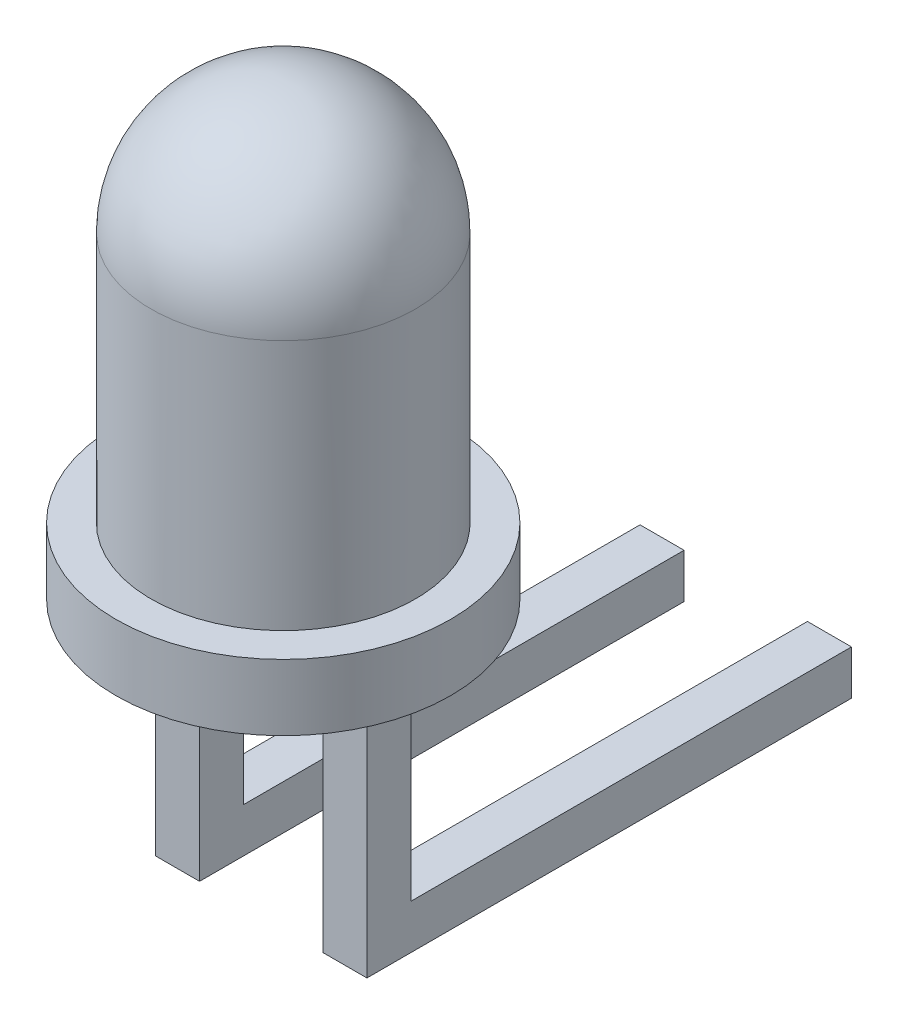
ISO-10303-21;
HEADER;
FILE_DESCRIPTION(('STEP AP214'),'2;1');
FILE_NAME('part.step','',(''),(''),'','','');
FILE_SCHEMA(('AUTOMOTIVE_DESIGN { 1 0 10303 214 1 1 1 1 }'));
ENDSEC;
DATA;
#1=APPLICATION_CONTEXT('core data for automotive mechanical design processes');
#2=APPLICATION_PROTOCOL_DEFINITION('international standard','automotive_design',2000,#1);
#3=PRODUCT_CONTEXT('',#1,'mechanical');
#4=PRODUCT('Part','Part','',(#3));
#5=PRODUCT_RELATED_PRODUCT_CATEGORY('part','',(#4));
#6=PRODUCT_DEFINITION_FORMATION('','',#4);
#7=PRODUCT_DEFINITION_CONTEXT('part definition',#1,'design');
#8=PRODUCT_DEFINITION('design','',#6,#7);
#9=PRODUCT_DEFINITION_SHAPE('','',#8);
#10=(LENGTH_UNIT() NAMED_UNIT(*) SI_UNIT(.MILLI.,.METRE.));
#11=(NAMED_UNIT(*) PLANE_ANGLE_UNIT() SI_UNIT($,.RADIAN.));
#12=(NAMED_UNIT(*) SI_UNIT($,.STERADIAN.) SOLID_ANGLE_UNIT());
#13=UNCERTAINTY_MEASURE_WITH_UNIT(LENGTH_MEASURE(1.E-05),#10,'distance_accuracy_value','');
#14=(GEOMETRIC_REPRESENTATION_CONTEXT(3) GLOBAL_UNCERTAINTY_ASSIGNED_CONTEXT((#13)) GLOBAL_UNIT_ASSIGNED_CONTEXT((#10,
#11,#12)) REPRESENTATION_CONTEXT('',''));
#15=CARTESIAN_POINT('',(0.,0.,0.));
#16=DIRECTION('',(0.,0.,1.));
#17=DIRECTION('',(1.,0.,0.));
#18=AXIS2_PLACEMENT_3D('',#15,#16,#17);
#19=CARTESIAN_POINT('',(0.,0.,-0.25));
#20=DIRECTION('',(0.,0.,-1.));
#21=DIRECTION('',(-1.,0.,0.));
#22=AXIS2_PLACEMENT_3D('',#19,#20,#21);
#23=PLANE('',#22);
#24=DIRECTION('',(0.,1.,0.));
#25=VECTOR('',#24,1.);
#26=CARTESIAN_POINT('',(1.2,2.46652278103782,-0.25));
#27=LINE('',#26,#25);
#28=CARTESIAN_POINT('',(1.2,-0.0286794382905547,-0.25));
#29=VERTEX_POINT('',#28);
#30=CARTESIAN_POINT('',(1.2,2.46652278103782,-0.25));
#31=VERTEX_POINT('',#30);
#32=EDGE_CURVE('E168',#29,#31,#27,.T.);
#33=ORIENTED_EDGE('',*,*,#32,.F.);
#34=DIRECTION('',(1.,0.,0.));
#35=VECTOR('',#34,1.);
#36=CARTESIAN_POINT('',(0.700000000000001,-0.0286794382905547,-0.25));
#37=LINE('',#36,#35);
#38=CARTESIAN_POINT('',(0.700000000000001,-0.0286794382905547,-0.25));
#39=VERTEX_POINT('',#38);
#40=EDGE_CURVE('E140',#39,#29,#37,.T.);
#41=ORIENTED_EDGE('',*,*,#40,.F.);
#42=DIRECTION('',(0.,-1.,0.));
#43=VECTOR('',#42,1.);
#44=CARTESIAN_POINT('',(0.700000000000001,-0.533477218962179,-0.25));
#45=LINE('',#44,#43);
#46=CARTESIAN_POINT('',(0.700000000000001,2.46652278103782,-0.25));
#47=VERTEX_POINT('',#46);
#48=EDGE_CURVE('E145',#47,#39,#45,.T.);
#49=ORIENTED_EDGE('',*,*,#48,.F.);
#50=DIRECTION('',(-1.,0.,0.));
#51=VECTOR('',#50,1.);
#52=CARTESIAN_POINT('',(0.700000000000001,2.46652278103782,-0.25));
#53=LINE('',#52,#51);
#54=EDGE_CURVE('E178',#31,#47,#53,.T.);
#55=ORIENTED_EDGE('',*,*,#54,.F.);
#56=EDGE_LOOP('',(#33,#41,#49,#55));
#57=FACE_BOUND('',#56,.T.);
#58=ADVANCED_FACE('F32',(#57),#23,.T.);
#59=CARTESIAN_POINT('',(0.,0.,-0.25));
#60=DIRECTION('',(0.,0.,-1.));
#61=DIRECTION('',(-1.,0.,0.));
#62=AXIS2_PLACEMENT_3D('',#59,#60,#61);
#63=PLANE('',#62);
#64=DIRECTION('',(0.,1.,0.));
#65=VECTOR('',#64,1.);
#66=CARTESIAN_POINT('',(-0.699999999999999,2.46652278103782,-0.25));
#67=LINE('',#66,#65);
#68=CARTESIAN_POINT('',(-0.699999999999999,-0.0286794382905551,-0.25));
#69=VERTEX_POINT('',#68);
#70=CARTESIAN_POINT('',(-0.699999999999999,2.46652278103782,-0.25));
#71=VERTEX_POINT('',#70);
#72=EDGE_CURVE('E192',#69,#71,#67,.T.);
#73=ORIENTED_EDGE('',*,*,#72,.F.);
#74=DIRECTION('',(1.,0.,0.));
#75=VECTOR('',#74,1.);
#76=CARTESIAN_POINT('',(-1.2,-0.0286794382905551,-0.25));
#77=LINE('',#76,#75);
#78=CARTESIAN_POINT('',(-1.2,-0.0286794382905551,-0.25));
#79=VERTEX_POINT('',#78);
#80=EDGE_CURVE('E146',#79,#69,#77,.T.);
#81=ORIENTED_EDGE('',*,*,#80,.F.);
#82=DIRECTION('',(0.,-1.,0.));
#83=VECTOR('',#82,1.);
#84=CARTESIAN_POINT('',(-1.2,-0.533477218962179,-0.25));
#85=LINE('',#84,#83);
#86=CARTESIAN_POINT('',(-1.2,2.46652278103782,-0.25));
#87=VERTEX_POINT('',#86);
#88=EDGE_CURVE('E201',#87,#79,#85,.T.);
#89=ORIENTED_EDGE('',*,*,#88,.F.);
#90=DIRECTION('',(-1.,0.,0.));
#91=VECTOR('',#90,1.);
#92=CARTESIAN_POINT('',(-0.699999999999999,2.46652278103782,-0.25));
#93=LINE('',#92,#91);
#94=EDGE_CURVE('E187',#71,#87,#93,.T.);
#95=ORIENTED_EDGE('',*,*,#94,.F.);
#96=EDGE_LOOP('',(#73,#81,#89,#95));
#97=FACE_BOUND('',#96,.T.);
#98=ADVANCED_FACE('F228',(#97),#63,.T.);
#99=CARTESIAN_POINT('',(-1.9,2.46652278103782,0.));
#100=DIRECTION('',(0.,-1.,0.));
#101=DIRECTION('',(1.,0.,0.));
#102=AXIS2_PLACEMENT_3D('',#99,#100,#101);
#103=PLANE('',#102);
#104=CARTESIAN_POINT('',(0.,2.46652278103782,0.));
#105=DIRECTION('',(0.,1.,0.));
#106=DIRECTION('',(-1.,0.,0.));
#107=AXIS2_PLACEMENT_3D('',#104,#105,#106);
#108=CIRCLE('',#107,1.9);
#109=CARTESIAN_POINT('',(-1.9,2.46652278103782,0.));
#110=VERTEX_POINT('',#109);
#111=EDGE_CURVE('E40',#110,#110,#108,.T.);
#112=ORIENTED_EDGE('',*,*,#111,.F.);
#113=EDGE_LOOP('',(#112));
#114=FACE_BOUND('',#113,.T.);
#115=DIRECTION('',(0.,0.,-1.));
#116=VECTOR('',#115,1.);
#117=CARTESIAN_POINT('',(-1.2,2.46652278103782,0.25));
#118=LINE('',#117,#116);
#119=CARTESIAN_POINT('',(-1.2,2.46652278103782,0.25));
#120=VERTEX_POINT('',#119);
#121=EDGE_CURVE('E211',#120,#87,#118,.T.);
#122=ORIENTED_EDGE('',*,*,#121,.F.);
#123=DIRECTION('',(-1.,0.,0.));
#124=VECTOR('',#123,1.);
#125=CARTESIAN_POINT('',(-0.699999999999999,2.46652278103782,0.25));
#126=LINE('',#125,#124);
#127=CARTESIAN_POINT('',(-0.699999999999999,2.46652278103782,0.25));
#128=VERTEX_POINT('',#127);
#129=EDGE_CURVE('E188',#128,#120,#126,.T.);
#130=ORIENTED_EDGE('',*,*,#129,.F.);
#131=DIRECTION('',(0.,0.,-1.));
#132=VECTOR('',#131,1.);
#133=CARTESIAN_POINT('',(-0.699999999999999,2.46652278103782,0.25));
#134=LINE('',#133,#132);
#135=EDGE_CURVE('E199',#128,#71,#134,.T.);
#136=ORIENTED_EDGE('',*,*,#135,.T.);
#137=ORIENTED_EDGE('',*,*,#94,.T.);
#138=EDGE_LOOP('',(#122,#130,#136,#137));
#139=FACE_BOUND('',#138,.T.);
#140=DIRECTION('',(0.,0.,-1.));
#141=VECTOR('',#140,1.);
#142=CARTESIAN_POINT('',(0.700000000000001,2.46652278103782,0.25));
#143=LINE('',#142,#141);
#144=CARTESIAN_POINT('',(0.700000000000001,2.46652278103782,0.25));
#145=VERTEX_POINT('',#144);
#146=EDGE_CURVE('E52',#145,#47,#143,.T.);
#147=ORIENTED_EDGE('',*,*,#146,.F.);
#148=DIRECTION('',(-1.,0.,0.));
#149=VECTOR('',#148,1.);
#150=CARTESIAN_POINT('',(0.700000000000001,2.46652278103782,0.25));
#151=LINE('',#150,#149);
#152=CARTESIAN_POINT('',(1.2,2.46652278103782,0.25));
#153=VERTEX_POINT('',#152);
#154=EDGE_CURVE('E47',#153,#145,#151,.T.);
#155=ORIENTED_EDGE('',*,*,#154,.F.);
#156=DIRECTION('',(0.,0.,-1.));
#157=VECTOR('',#156,1.);
#158=CARTESIAN_POINT('',(1.2,2.46652278103782,0.25));
#159=LINE('',#158,#157);
#160=EDGE_CURVE('E185',#153,#31,#159,.T.);
#161=ORIENTED_EDGE('',*,*,#160,.T.);
#162=ORIENTED_EDGE('',*,*,#54,.T.);
#163=EDGE_LOOP('',(#147,#155,#161,#162));
#164=FACE_BOUND('',#163,.T.);
#165=ADVANCED_FACE('F225',(#114,#139,#164),#103,.T.);
#166=CARTESIAN_POINT('',(-1.5,3.21652278103782,0.));
#167=DIRECTION('',(0.,1.,0.));
#168=DIRECTION('',(-1.,0.,0.));
#169=AXIS2_PLACEMENT_3D('',#166,#167,#168);
#170=PLANE('',#169);
#171=CARTESIAN_POINT('',(0.,3.21652278103782,0.));
#172=DIRECTION('',(0.,1.,0.));
#173=DIRECTION('',(-1.,0.,0.));
#174=AXIS2_PLACEMENT_3D('',#171,#172,#173);
#175=CIRCLE('',#174,1.9);
#176=CARTESIAN_POINT('',(-1.9,3.21652278103782,0.));
#177=VERTEX_POINT('',#176);
#178=EDGE_CURVE('E11',#177,#177,#175,.T.);
#179=ORIENTED_EDGE('',*,*,#178,.T.);
#180=EDGE_LOOP('',(#179));
#181=FACE_BOUND('',#180,.T.);
#182=CARTESIAN_POINT('',(0.,3.21652278103782,0.));
#183=DIRECTION('',(0.,1.,0.));
#184=DIRECTION('',(-1.,0.,0.));
#185=AXIS2_PLACEMENT_3D('',#182,#183,#184);
#186=CIRCLE('',#185,1.5);
#187=CARTESIAN_POINT('',(-1.5,3.21652278103782,0.));
#188=VERTEX_POINT('',#187);
#189=EDGE_CURVE('E214',#188,#188,#186,.T.);
#190=ORIENTED_EDGE('',*,*,#189,.F.);
#191=EDGE_LOOP('',(#190));
#192=FACE_BOUND('',#191,.T.);
#193=ADVANCED_FACE('F34',(#181,#192),#170,.T.);
#194=CARTESIAN_POINT('',(0.,7.56652278103782,0.));
#195=DIRECTION('',(0.,1.,0.));
#196=DIRECTION('',(-1.,0.,0.));
#197=AXIS2_PLACEMENT_3D('',#194,#195,#196);
#198=CYLINDRICAL_SURFACE('',#197,1.9);
#199=ORIENTED_EDGE('',*,*,#111,.T.);
#200=EDGE_LOOP('',(#199));
#201=FACE_BOUND('',#200,.T.);
#202=ORIENTED_EDGE('',*,*,#178,.F.);
#203=EDGE_LOOP('',(#202));
#204=FACE_BOUND('',#203,.T.);
#205=ADVANCED_FACE('F222',(#201,#204),#198,.T.);
#206=CARTESIAN_POINT('',(0.,6.06652278103782,0.));
#207=DIRECTION('',(0.,1.,0.));
#208=DIRECTION('',(1.,0.,0.));
#209=AXIS2_PLACEMENT_3D('',#206,#207,#208);
#210=SPHERICAL_SURFACE('',#209,1.5);
#211=CARTESIAN_POINT('',(0.,6.06652278103782,0.));
#212=DIRECTION('',(0.,1.,0.));
#213=DIRECTION('',(-1.,0.,0.));
#214=AXIS2_PLACEMENT_3D('',#211,#212,#213);
#215=CIRCLE('',#214,1.5);
#216=CARTESIAN_POINT('',(-1.5,6.06652278103782,0.));
#217=VERTEX_POINT('',#216);
#218=EDGE_CURVE('E217',#217,#217,#215,.T.);
#219=ORIENTED_EDGE('',*,*,#218,.T.);
#220=EDGE_LOOP('',(#219));
#221=FACE_BOUND('',#220,.T.);
#222=ADVANCED_FACE('F409',(#221),#210,.T.);
#223=CARTESIAN_POINT('',(0.,7.56652278103782,0.));
#224=DIRECTION('',(0.,1.,0.));
#225=DIRECTION('',(-1.,0.,0.));
#226=AXIS2_PLACEMENT_3D('',#223,#224,#225);
#227=CYLINDRICAL_SURFACE('',#226,1.5);
#228=ORIENTED_EDGE('',*,*,#189,.T.);
#229=EDGE_LOOP('',(#228));
#230=FACE_BOUND('',#229,.T.);
#231=ORIENTED_EDGE('',*,*,#218,.F.);
#232=EDGE_LOOP('',(#231));
#233=FACE_BOUND('',#232,.T.);
#234=ADVANCED_FACE('F265',(#230,#233),#227,.T.);
#235=CARTESIAN_POINT('',(-1.2,-0.533477218962179,0.25));
#236=DIRECTION('',(1.,0.,0.));
#237=DIRECTION('',(0.,0.,-1.));
#238=AXIS2_PLACEMENT_3D('',#235,#236,#237);
#239=PLANE('',#238);
#240=ORIENTED_EDGE('',*,*,#88,.T.);
#241=DIRECTION('',(0.,0.,1.));
#242=VECTOR('',#241,1.);
#243=CARTESIAN_POINT('',(-1.2,-0.0286794382905551,-5.25));
#244=LINE('',#243,#242);
#245=CARTESIAN_POINT('',(-1.2,-0.0286794382905551,-5.25));
#246=VERTEX_POINT('',#245);
#247=EDGE_CURVE('E166',#246,#79,#244,.T.);
#248=ORIENTED_EDGE('',*,*,#247,.F.);
#249=DIRECTION('',(0.,1.,0.));
#250=VECTOR('',#249,1.);
#251=CARTESIAN_POINT('',(-1.2,-0.533477218962179,-5.25));
#252=LINE('',#251,#250);
#253=CARTESIAN_POINT('',(-1.2,-0.533477218962179,-5.25));
#254=VERTEX_POINT('',#253);
#255=EDGE_CURVE('E148',#254,#246,#252,.T.);
#256=ORIENTED_EDGE('',*,*,#255,.F.);
#257=DIRECTION('',(0.,0.,-1.));
#258=VECTOR('',#257,1.);
#259=CARTESIAN_POINT('',(-1.2,-0.533477218962179,0.25));
#260=LINE('',#259,#258);
#261=CARTESIAN_POINT('',(-1.2,-0.533477218962179,0.25));
#262=VERTEX_POINT('',#261);
#263=EDGE_CURVE('E209',#262,#254,#260,.T.);
#264=ORIENTED_EDGE('',*,*,#263,.F.);
#265=DIRECTION('',(0.,-1.,0.));
#266=VECTOR('',#265,1.);
#267=CARTESIAN_POINT('',(-1.2,-0.533477218962179,0.25));
#268=LINE('',#267,#266);
#269=EDGE_CURVE('E191',#120,#262,#268,.T.);
#270=ORIENTED_EDGE('',*,*,#269,.F.);
#271=ORIENTED_EDGE('',*,*,#121,.T.);
#272=EDGE_LOOP('',(#240,#248,#256,#264,#270,#271));
#273=FACE_BOUND('',#272,.T.);
#274=ADVANCED_FACE('F235',(#273),#239,.F.);
#275=CARTESIAN_POINT('',(-0.699999999999999,-0.533477218962179,0.25));
#276=DIRECTION('',(0.,1.,0.));
#277=DIRECTION('',(-1.,0.,0.));
#278=AXIS2_PLACEMENT_3D('',#275,#276,#277);
#279=PLANE('',#278);
#280=ORIENTED_EDGE('',*,*,#263,.T.);
#281=DIRECTION('',(-1.,0.,0.));
#282=VECTOR('',#281,1.);
#283=CARTESIAN_POINT('',(-1.2,-0.533477218962179,-5.25));
#284=LINE('',#283,#282);
#285=CARTESIAN_POINT('',(-0.699999999999999,-0.533477218962179,-5.25));
#286=VERTEX_POINT('',#285);
#287=EDGE_CURVE('E160',#286,#254,#284,.T.);
#288=ORIENTED_EDGE('',*,*,#287,.F.);
#289=DIRECTION('',(0.,0.,-1.));
#290=VECTOR('',#289,1.);
#291=CARTESIAN_POINT('',(-0.699999999999999,-0.533477218962179,0.25));
#292=LINE('',#291,#290);
#293=CARTESIAN_POINT('',(-0.699999999999999,-0.533477218962179,0.25));
#294=VERTEX_POINT('',#293);
#295=EDGE_CURVE('E207',#294,#286,#292,.T.);
#296=ORIENTED_EDGE('',*,*,#295,.F.);
#297=DIRECTION('',(1.,0.,0.));
#298=VECTOR('',#297,1.);
#299=CARTESIAN_POINT('',(-0.699999999999999,-0.533477218962179,0.25));
#300=LINE('',#299,#298);
#301=EDGE_CURVE('E194',#262,#294,#300,.T.);
#302=ORIENTED_EDGE('',*,*,#301,.F.);
#303=EDGE_LOOP('',(#280,#288,#296,#302));
#304=FACE_BOUND('',#303,.T.);
#305=ADVANCED_FACE('F257',(#304),#279,.F.);
#306=CARTESIAN_POINT('',(-0.699999999999999,2.46652278103782,0.25));
#307=DIRECTION('',(-1.,0.,0.));
#308=DIRECTION('',(0.,-1.,0.));
#309=AXIS2_PLACEMENT_3D('',#306,#307,#308);
#310=PLANE('',#309);
#311=ORIENTED_EDGE('',*,*,#295,.T.);
#312=DIRECTION('',(0.,-1.,0.));
#313=VECTOR('',#312,1.);
#314=CARTESIAN_POINT('',(-0.699999999999999,-0.533477218962179,-5.25));
#315=LINE('',#314,#313);
#316=CARTESIAN_POINT('',(-0.699999999999999,-0.0286794382905551,-5.25));
#317=VERTEX_POINT('',#316);
#318=EDGE_CURVE('E157',#317,#286,#315,.T.);
#319=ORIENTED_EDGE('',*,*,#318,.F.);
#320=DIRECTION('',(0.,0.,1.));
#321=VECTOR('',#320,1.);
#322=CARTESIAN_POINT('',(-0.699999999999999,-0.0286794382905551,-5.25));
#323=LINE('',#322,#321);
#324=EDGE_CURVE('E162',#317,#69,#323,.T.);
#325=ORIENTED_EDGE('',*,*,#324,.T.);
#326=ORIENTED_EDGE('',*,*,#72,.T.);
#327=ORIENTED_EDGE('',*,*,#135,.F.);
#328=DIRECTION('',(0.,1.,0.));
#329=VECTOR('',#328,1.);
#330=CARTESIAN_POINT('',(-0.699999999999999,2.46652278103782,0.25));
#331=LINE('',#330,#329);
#332=EDGE_CURVE('E196',#294,#128,#331,.T.);
#333=ORIENTED_EDGE('',*,*,#332,.F.);
#334=EDGE_LOOP('',(#311,#319,#325,#326,#327,#333));
#335=FACE_BOUND('',#334,.T.);
#336=ADVANCED_FACE('F244',(#335),#310,.F.);
#337=CARTESIAN_POINT('',(0.,0.,0.25));
#338=DIRECTION('',(0.,0.,-1.));
#339=DIRECTION('',(-1.,0.,0.));
#340=AXIS2_PLACEMENT_3D('',#337,#338,#339);
#341=PLANE('',#340);
#342=ORIENTED_EDGE('',*,*,#129,.T.);
#343=ORIENTED_EDGE('',*,*,#269,.T.);
#344=ORIENTED_EDGE('',*,*,#301,.T.);
#345=ORIENTED_EDGE('',*,*,#332,.T.);
#346=EDGE_LOOP('',(#342,#343,#344,#345));
#347=FACE_BOUND('',#346,.T.);
#348=ADVANCED_FACE('F239',(#347),#341,.F.);
#349=CARTESIAN_POINT('',(1.2,2.46652278103782,0.25));
#350=DIRECTION('',(-1.,0.,0.));
#351=DIRECTION('',(0.,-1.,0.));
#352=AXIS2_PLACEMENT_3D('',#349,#350,#351);
#353=PLANE('',#352);
#354=DIRECTION('',(0.,0.,-1.));
#355=VECTOR('',#354,1.);
#356=CARTESIAN_POINT('',(1.2,-0.533477218962179,0.25));
#357=LINE('',#356,#355);
#358=CARTESIAN_POINT('',(1.2,-0.533477218962179,0.25));
#359=VERTEX_POINT('',#358);
#360=CARTESIAN_POINT('',(1.2,-0.533477218962179,-5.25));
#361=VERTEX_POINT('',#360);
#362=EDGE_CURVE('E176',#359,#361,#357,.T.);
#363=ORIENTED_EDGE('',*,*,#362,.T.);
#364=DIRECTION('',(0.,-1.,0.));
#365=VECTOR('',#364,1.);
#366=CARTESIAN_POINT('',(1.2,-0.533477218962179,-5.25));
#367=LINE('',#366,#365);
#368=CARTESIAN_POINT('',(1.2,-0.0286794382905547,-5.25));
#369=VERTEX_POINT('',#368);
#370=EDGE_CURVE('E130',#369,#361,#367,.T.);
#371=ORIENTED_EDGE('',*,*,#370,.F.);
#372=DIRECTION('',(0.,0.,1.));
#373=VECTOR('',#372,1.);
#374=CARTESIAN_POINT('',(1.2,-0.0286794382905547,-5.25));
#375=LINE('',#374,#373);
#376=EDGE_CURVE('E126',#369,#29,#375,.T.);
#377=ORIENTED_EDGE('',*,*,#376,.T.);
#378=ORIENTED_EDGE('',*,*,#32,.T.);
#379=ORIENTED_EDGE('',*,*,#160,.F.);
#380=DIRECTION('',(0.,1.,0.));
#381=VECTOR('',#380,1.);
#382=CARTESIAN_POINT('',(1.2,2.46652278103782,0.25));
#383=LINE('',#382,#381);
#384=EDGE_CURVE('E169',#359,#153,#383,.T.);
#385=ORIENTED_EDGE('',*,*,#384,.F.);
#386=EDGE_LOOP('',(#363,#371,#377,#378,#379,#385));
#387=FACE_BOUND('',#386,.T.);
#388=ADVANCED_FACE('F285',(#387),#353,.F.);
#389=CARTESIAN_POINT('',(0.700000000000001,-0.533477218962179,0.25));
#390=DIRECTION('',(1.,0.,0.));
#391=DIRECTION('',(0.,1.,0.));
#392=AXIS2_PLACEMENT_3D('',#389,#390,#391);
#393=PLANE('',#392);
#394=ORIENTED_EDGE('',*,*,#48,.T.);
#395=DIRECTION('',(0.,0.,1.));
#396=VECTOR('',#395,1.);
#397=CARTESIAN_POINT('',(0.700000000000001,-0.0286794382905547,-5.25));
#398=LINE('',#397,#396);
#399=CARTESIAN_POINT('',(0.700000000000001,-0.0286794382905547,-5.25));
#400=VERTEX_POINT('',#399);
#401=EDGE_CURVE('E123',#400,#39,#398,.T.);
#402=ORIENTED_EDGE('',*,*,#401,.F.);
#403=DIRECTION('',(0.,1.,0.));
#404=VECTOR('',#403,1.);
#405=CARTESIAN_POINT('',(0.700000000000001,-0.533477218962179,-5.25));
#406=LINE('',#405,#404);
#407=CARTESIAN_POINT('',(0.700000000000001,-0.533477218962179,-5.25));
#408=VERTEX_POINT('',#407);
#409=EDGE_CURVE('E131',#408,#400,#406,.T.);
#410=ORIENTED_EDGE('',*,*,#409,.F.);
#411=DIRECTION('',(0.,0.,-1.));
#412=VECTOR('',#411,1.);
#413=CARTESIAN_POINT('',(0.700000000000001,-0.533477218962179,0.25));
#414=LINE('',#413,#412);
#415=CARTESIAN_POINT('',(0.700000000000001,-0.533477218962179,0.25));
#416=VERTEX_POINT('',#415);
#417=EDGE_CURVE('E182',#416,#408,#414,.T.);
#418=ORIENTED_EDGE('',*,*,#417,.F.);
#419=DIRECTION('',(0.,-1.,0.));
#420=VECTOR('',#419,1.);
#421=CARTESIAN_POINT('',(0.700000000000001,-0.533477218962179,0.25));
#422=LINE('',#421,#420);
#423=EDGE_CURVE('E172',#145,#416,#422,.T.);
#424=ORIENTED_EDGE('',*,*,#423,.F.);
#425=ORIENTED_EDGE('',*,*,#146,.T.);
#426=EDGE_LOOP('',(#394,#402,#410,#418,#424,#425));
#427=FACE_BOUND('',#426,.T.);
#428=ADVANCED_FACE('F143',(#427),#393,.F.);
#429=CARTESIAN_POINT('',(1.2,-0.533477218962179,0.25));
#430=DIRECTION('',(0.,1.,0.));
#431=DIRECTION('',(0.,0.,1.));
#432=AXIS2_PLACEMENT_3D('',#429,#430,#431);
#433=PLANE('',#432);
#434=ORIENTED_EDGE('',*,*,#417,.T.);
#435=DIRECTION('',(-1.,0.,0.));
#436=VECTOR('',#435,1.);
#437=CARTESIAN_POINT('',(0.700000000000001,-0.533477218962179,-5.25));
#438=LINE('',#437,#436);
#439=EDGE_CURVE('E137',#361,#408,#438,.T.);
#440=ORIENTED_EDGE('',*,*,#439,.F.);
#441=ORIENTED_EDGE('',*,*,#362,.F.);
#442=DIRECTION('',(1.,0.,0.));
#443=VECTOR('',#442,1.);
#444=CARTESIAN_POINT('',(1.2,-0.533477218962179,0.25));
#445=LINE('',#444,#443);
#446=EDGE_CURVE('E174',#416,#359,#445,.T.);
#447=ORIENTED_EDGE('',*,*,#446,.F.);
#448=EDGE_LOOP('',(#434,#440,#441,#447));
#449=FACE_BOUND('',#448,.T.);
#450=ADVANCED_FACE('F279',(#449),#433,.F.);
#451=CARTESIAN_POINT('',(0.,0.,0.25));
#452=DIRECTION('',(0.,0.,-1.));
#453=DIRECTION('',(-1.,0.,0.));
#454=AXIS2_PLACEMENT_3D('',#451,#452,#453);
#455=PLANE('',#454);
#456=ORIENTED_EDGE('',*,*,#384,.T.);
#457=ORIENTED_EDGE('',*,*,#154,.T.);
#458=ORIENTED_EDGE('',*,*,#423,.T.);
#459=ORIENTED_EDGE('',*,*,#446,.T.);
#460=EDGE_LOOP('',(#456,#457,#458,#459));
#461=FACE_BOUND('',#460,.T.);
#462=ADVANCED_FACE('F277',(#461),#455,.F.);
#463=CARTESIAN_POINT('',(-1.2,-0.0286794382905551,-5.25));
#464=DIRECTION('',(0.,-1.,0.));
#465=DIRECTION('',(0.,0.,-1.));
#466=AXIS2_PLACEMENT_3D('',#463,#464,#465);
#467=PLANE('',#466);
#468=ORIENTED_EDGE('',*,*,#80,.T.);
#469=ORIENTED_EDGE('',*,*,#324,.F.);
#470=DIRECTION('',(1.,0.,0.));
#471=VECTOR('',#470,1.);
#472=CARTESIAN_POINT('',(-1.2,-0.0286794382905551,-5.25));
#473=LINE('',#472,#471);
#474=EDGE_CURVE('E155',#246,#317,#473,.T.);
#475=ORIENTED_EDGE('',*,*,#474,.F.);
#476=ORIENTED_EDGE('',*,*,#247,.T.);
#477=EDGE_LOOP('',(#468,#469,#475,#476));
#478=FACE_BOUND('',#477,.T.);
#479=ADVANCED_FACE('F250',(#478),#467,.F.);
#480=CARTESIAN_POINT('',(0.,0.,-5.25));
#481=DIRECTION('',(0.,0.,-1.));
#482=DIRECTION('',(-1.,0.,0.));
#483=AXIS2_PLACEMENT_3D('',#480,#481,#482);
#484=PLANE('',#483);
#485=ORIENTED_EDGE('',*,*,#255,.T.);
#486=ORIENTED_EDGE('',*,*,#474,.T.);
#487=ORIENTED_EDGE('',*,*,#318,.T.);
#488=ORIENTED_EDGE('',*,*,#287,.T.);
#489=EDGE_LOOP('',(#485,#486,#487,#488));
#490=FACE_BOUND('',#489,.T.);
#491=ADVANCED_FACE('F254',(#490),#484,.T.);
#492=CARTESIAN_POINT('',(0.700000000000001,-0.0286794382905547,-5.25));
#493=DIRECTION('',(0.,-1.,0.));
#494=DIRECTION('',(0.,0.,-1.));
#495=AXIS2_PLACEMENT_3D('',#492,#493,#494);
#496=PLANE('',#495);
#497=ORIENTED_EDGE('',*,*,#40,.T.);
#498=ORIENTED_EDGE('',*,*,#376,.F.);
#499=DIRECTION('',(1.,0.,0.));
#500=VECTOR('',#499,1.);
#501=CARTESIAN_POINT('',(0.700000000000001,-0.0286794382905547,-5.25));
#502=LINE('',#501,#500);
#503=EDGE_CURVE('E119',#400,#369,#502,.T.);
#504=ORIENTED_EDGE('',*,*,#503,.F.);
#505=ORIENTED_EDGE('',*,*,#401,.T.);
#506=EDGE_LOOP('',(#497,#498,#504,#505));
#507=FACE_BOUND('',#506,.T.);
#508=ADVANCED_FACE('F121',(#507),#496,.F.);
#509=CARTESIAN_POINT('',(0.,0.,-5.25));
#510=DIRECTION('',(0.,0.,-1.));
#511=DIRECTION('',(-1.,0.,0.));
#512=AXIS2_PLACEMENT_3D('',#509,#510,#511);
#513=PLANE('',#512);
#514=ORIENTED_EDGE('',*,*,#409,.T.);
#515=ORIENTED_EDGE('',*,*,#503,.T.);
#516=ORIENTED_EDGE('',*,*,#370,.T.);
#517=ORIENTED_EDGE('',*,*,#439,.T.);
#518=EDGE_LOOP('',(#514,#515,#516,#517));
#519=FACE_BOUND('',#518,.T.);
#520=ADVANCED_FACE('F135',(#519),#513,.T.);
#521=CLOSED_SHELL('',(#58,#98,#165,#193,#205,#222,#234,#274,#305,#336,#348,#388,#428,#450,#462,
#479,#491,#508,#520));
#522=MANIFOLD_SOLID_BREP('B2',#521);
#523=ADVANCED_BREP_SHAPE_REPRESENTATION('',(#18,#522),#14);
#524=SHAPE_DEFINITION_REPRESENTATION(#9,#523);
ENDSEC;
END-ISO-10303-21;
